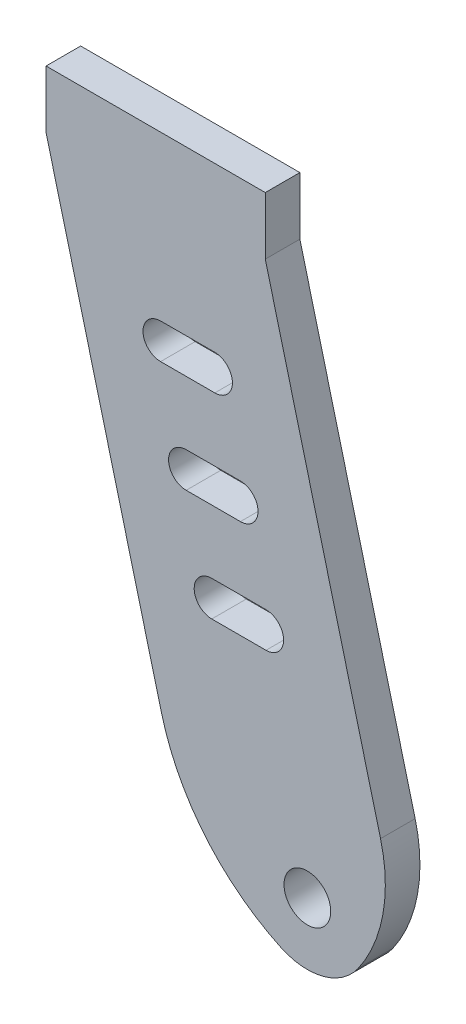
ISO-10303-21;
HEADER;
FILE_DESCRIPTION(('STEP AP214'),'2;1');
FILE_NAME('part.step','',(''),(''),'','','');
FILE_SCHEMA(('AUTOMOTIVE_DESIGN { 1 0 10303 214 1 1 1 1 }'));
ENDSEC;
DATA;
#1=APPLICATION_CONTEXT('core data for automotive mechanical design processes');
#2=APPLICATION_PROTOCOL_DEFINITION('international standard','automotive_design',2000,#1);
#3=PRODUCT_CONTEXT('',#1,'mechanical');
#4=PRODUCT('Part','Part','',(#3));
#5=PRODUCT_RELATED_PRODUCT_CATEGORY('part','',(#4));
#6=PRODUCT_DEFINITION_FORMATION('','',#4);
#7=PRODUCT_DEFINITION_CONTEXT('part definition',#1,'design');
#8=PRODUCT_DEFINITION('design','',#6,#7);
#9=PRODUCT_DEFINITION_SHAPE('','',#8);
#10=(LENGTH_UNIT() NAMED_UNIT(*) SI_UNIT(.MILLI.,.METRE.));
#11=(NAMED_UNIT(*) PLANE_ANGLE_UNIT() SI_UNIT($,.RADIAN.));
#12=(NAMED_UNIT(*) SI_UNIT($,.STERADIAN.) SOLID_ANGLE_UNIT());
#13=UNCERTAINTY_MEASURE_WITH_UNIT(LENGTH_MEASURE(1.E-05),#10,'distance_accuracy_value','');
#14=(GEOMETRIC_REPRESENTATION_CONTEXT(3) GLOBAL_UNCERTAINTY_ASSIGNED_CONTEXT((#13)) GLOBAL_UNIT_ASSIGNED_CONTEXT((#10,
#11,#12)) REPRESENTATION_CONTEXT('',''));
#15=CARTESIAN_POINT('',(0.,0.,0.));
#16=DIRECTION('',(0.,0.,1.));
#17=DIRECTION('',(1.,0.,0.));
#18=AXIS2_PLACEMENT_3D('',#15,#16,#17);
#19=CARTESIAN_POINT('',(56.937215015227,-77.4103110623859,6.));
#20=DIRECTION('',(0.,0.,1.));
#21=DIRECTION('',(1.,0.,0.));
#22=AXIS2_PLACEMENT_3D('',#19,#20,#21);
#23=PLANE('',#22);
#24=DIRECTION('',(0.,-1.,0.));
#25=VECTOR('',#24,1.);
#26=CARTESIAN_POINT('',(0.,0.,6.));
#27=LINE('',#26,#25);
#28=CARTESIAN_POINT('',(0.,0.,6.));
#29=VERTEX_POINT('',#28);
#30=CARTESIAN_POINT('',(0.,-10.,6.));
#31=VERTEX_POINT('',#30);
#32=EDGE_CURVE('E325',#29,#31,#27,.T.);
#33=ORIENTED_EDGE('',*,*,#32,.T.);
#34=DIRECTION('',(0.251163451319716,-0.967944688874921,0.));
#35=VECTOR('',#34,1.);
#36=CARTESIAN_POINT('',(0.,-10.,6.));
#37=LINE('',#36,#35);
#38=CARTESIAN_POINT('',(19.9800525524834,-87.,6.));
#39=VERTEX_POINT('',#38);
#40=EDGE_CURVE('E329',#31,#39,#37,.T.);
#41=ORIENTED_EDGE('',*,*,#40,.T.);
#42=CARTESIAN_POINT('',(56.937215015227,-77.4103110623859,6.));
#43=DIRECTION('',(0.,0.,1.));
#44=DIRECTION('',(1.,0.,0.));
#45=AXIS2_PLACEMENT_3D('',#42,#43,#44);
#46=CIRCLE('',#45,38.181068492354);
#47=CARTESIAN_POINT('',(40.7377652284611,-111.984460622771,6.));
#48=VERTEX_POINT('',#47);
#49=EDGE_CURVE('E333',#39,#48,#46,.T.);
#50=ORIENTED_EDGE('',*,*,#49,.T.);
#51=CARTESIAN_POINT('',(45.2987712999021,-102.25,6.));
#52=DIRECTION('',(0.,0.,1.));
#53=DIRECTION('',(1.,0.,0.));
#54=AXIS2_PLACEMENT_3D('',#51,#52,#53);
#55=CIRCLE('',#54,10.75);
#56=CARTESIAN_POINT('',(54.0934979884277,-108.431851055642,6.));
#57=VERTEX_POINT('',#56);
#58=EDGE_CURVE('E336',#48,#57,#55,.T.);
#59=ORIENTED_EDGE('',*,*,#58,.T.);
#60=CARTESIAN_POINT('',(32.8718944540329,-93.5150950428975,6.));
#61=DIRECTION('',(0.,0.,1.));
#62=DIRECTION('',(1.,0.,0.));
#63=AXIS2_PLACEMENT_3D('',#60,#61,#62);
#64=CIRCLE('',#63,25.9396620354772);
#65=CARTESIAN_POINT('',(57.9800525524834,-87.,6.));
#66=VERTEX_POINT('',#65);
#67=EDGE_CURVE('E339',#57,#66,#64,.T.);
#68=ORIENTED_EDGE('',*,*,#67,.T.);
#69=DIRECTION('',(-0.251163451319716,0.967944688874921,0.));
#70=VECTOR('',#69,1.);
#71=CARTESIAN_POINT('',(57.9800525524834,-87.,6.));
#72=LINE('',#71,#70);
#73=CARTESIAN_POINT('',(38.,-10.,6.));
#74=VERTEX_POINT('',#73);
#75=EDGE_CURVE('E342',#66,#74,#72,.T.);
#76=ORIENTED_EDGE('',*,*,#75,.T.);
#77=DIRECTION('',(0.,1.,0.));
#78=VECTOR('',#77,1.);
#79=CARTESIAN_POINT('',(38.,0.,6.));
#80=LINE('',#79,#78);
#81=CARTESIAN_POINT('',(38.,0.,6.));
#82=VERTEX_POINT('',#81);
#83=EDGE_CURVE('E345',#74,#82,#80,.T.);
#84=ORIENTED_EDGE('',*,*,#83,.T.);
#85=DIRECTION('',(-1.,0.,0.));
#86=VECTOR('',#85,1.);
#87=CARTESIAN_POINT('',(0.,0.,6.));
#88=LINE('',#87,#86);
#89=EDGE_CURVE('E348',#82,#29,#88,.T.);
#90=ORIENTED_EDGE('',*,*,#89,.T.);
#91=EDGE_LOOP('',(#33,#41,#50,#59,#68,#76,#84,#90));
#92=FACE_BOUND('',#91,.T.);
#93=CARTESIAN_POINT('',(45.2987712999021,-102.25,6.));
#94=DIRECTION('',(0.,0.,1.));
#95=DIRECTION('',(1.,0.,0.));
#96=AXIS2_PLACEMENT_3D('',#93,#94,#95);
#97=CIRCLE('',#96,4.05);
#98=CARTESIAN_POINT('',(49.3487712999021,-102.25,6.));
#99=VERTEX_POINT('',#98);
#100=EDGE_CURVE('E317',#99,#99,#97,.T.);
#101=ORIENTED_EDGE('',*,*,#100,.F.);
#102=EDGE_LOOP('',(#101));
#103=FACE_BOUND('',#102,.T.);
#104=DIRECTION('',(1.,0.,0.));
#105=VECTOR('',#104,1.);
#106=CARTESIAN_POINT('',(24.2900262762417,-51.55,6.));
#107=LINE('',#106,#105);
#108=CARTESIAN_POINT('',(24.2900262762417,-51.55,6.));
#109=VERTEX_POINT('',#108);
#110=CARTESIAN_POINT('',(33.6900262762417,-51.55,6.));
#111=VERTEX_POINT('',#110);
#112=EDGE_CURVE('E277',#109,#111,#107,.T.);
#113=ORIENTED_EDGE('',*,*,#112,.F.);
#114=CARTESIAN_POINT('',(24.2900262762417,-48.5,6.));
#115=DIRECTION('',(0.,0.,1.));
#116=DIRECTION('',(1.,0.,0.));
#117=AXIS2_PLACEMENT_3D('',#114,#115,#116);
#118=CIRCLE('',#117,3.05000000000001);
#119=CARTESIAN_POINT('',(24.2900262762417,-45.45,6.));
#120=VERTEX_POINT('',#119);
#121=EDGE_CURVE('E274',#120,#109,#118,.T.);
#122=ORIENTED_EDGE('',*,*,#121,.F.);
#123=DIRECTION('',(-1.,0.,0.));
#124=VECTOR('',#123,1.);
#125=CARTESIAN_POINT('',(24.2900262762417,-45.45,6.));
#126=LINE('',#125,#124);
#127=CARTESIAN_POINT('',(33.6900262762417,-45.45,6.));
#128=VERTEX_POINT('',#127);
#129=EDGE_CURVE('E285',#128,#120,#126,.T.);
#130=ORIENTED_EDGE('',*,*,#129,.F.);
#131=CARTESIAN_POINT('',(33.6900262762417,-48.5,6.));
#132=DIRECTION('',(0.,0.,1.));
#133=DIRECTION('',(1.,0.,0.));
#134=AXIS2_PLACEMENT_3D('',#131,#132,#133);
#135=CIRCLE('',#134,3.05000000000001);
#136=EDGE_CURVE('E281',#111,#128,#135,.T.);
#137=ORIENTED_EDGE('',*,*,#136,.F.);
#138=EDGE_LOOP('',(#113,#122,#130,#137));
#139=FACE_BOUND('',#138,.T.);
#140=DIRECTION('',(1.,0.,0.));
#141=VECTOR('',#140,1.);
#142=CARTESIAN_POINT('',(28.7271548301049,-68.65,6.));
#143=LINE('',#142,#141);
#144=CARTESIAN_POINT('',(28.7271548301049,-68.65,6.));
#145=VERTEX_POINT('',#144);
#146=CARTESIAN_POINT('',(38.1271548301049,-68.65,6.));
#147=VERTEX_POINT('',#146);
#148=EDGE_CURVE('E234',#145,#147,#143,.T.);
#149=ORIENTED_EDGE('',*,*,#148,.F.);
#150=CARTESIAN_POINT('',(28.7271548301049,-65.6,6.));
#151=DIRECTION('',(0.,0.,1.));
#152=DIRECTION('',(1.,0.,0.));
#153=AXIS2_PLACEMENT_3D('',#150,#151,#152);
#154=CIRCLE('',#153,3.05);
#155=CARTESIAN_POINT('',(28.7271548301049,-62.55,6.));
#156=VERTEX_POINT('',#155);
#157=EDGE_CURVE('E231',#156,#145,#154,.T.);
#158=ORIENTED_EDGE('',*,*,#157,.F.);
#159=DIRECTION('',(-1.,0.,0.));
#160=VECTOR('',#159,1.);
#161=CARTESIAN_POINT('',(28.7271548301049,-62.55,6.));
#162=LINE('',#161,#160);
#163=CARTESIAN_POINT('',(38.1271548301049,-62.55,6.));
#164=VERTEX_POINT('',#163);
#165=EDGE_CURVE('E242',#164,#156,#162,.T.);
#166=ORIENTED_EDGE('',*,*,#165,.F.);
#167=CARTESIAN_POINT('',(38.1271548301049,-65.6,6.));
#168=DIRECTION('',(0.,0.,1.));
#169=DIRECTION('',(1.,0.,0.));
#170=AXIS2_PLACEMENT_3D('',#167,#168,#169);
#171=CIRCLE('',#170,3.05);
#172=EDGE_CURVE('E238',#147,#164,#171,.T.);
#173=ORIENTED_EDGE('',*,*,#172,.F.);
#174=EDGE_LOOP('',(#149,#158,#166,#173));
#175=FACE_BOUND('',#174,.T.);
#176=DIRECTION('',(1.,0.,0.));
#177=VECTOR('',#176,1.);
#178=CARTESIAN_POINT('',(19.8528977223785,-34.45,6.));
#179=LINE('',#178,#177);
#180=CARTESIAN_POINT('',(19.8528977223785,-34.45,6.));
#181=VERTEX_POINT('',#180);
#182=CARTESIAN_POINT('',(29.2528977223785,-34.45,6.));
#183=VERTEX_POINT('',#182);
#184=EDGE_CURVE('E192',#181,#183,#179,.T.);
#185=ORIENTED_EDGE('',*,*,#184,.F.);
#186=CARTESIAN_POINT('',(19.8528977223785,-31.4,6.));
#187=DIRECTION('',(0.,0.,1.));
#188=DIRECTION('',(1.,0.,0.));
#189=AXIS2_PLACEMENT_3D('',#186,#187,#188);
#190=CIRCLE('',#189,3.05);
#191=CARTESIAN_POINT('',(19.8528977223785,-28.35,6.));
#192=VERTEX_POINT('',#191);
#193=EDGE_CURVE('E183',#192,#181,#190,.T.);
#194=ORIENTED_EDGE('',*,*,#193,.F.);
#195=DIRECTION('',(-1.,0.,0.));
#196=VECTOR('',#195,1.);
#197=CARTESIAN_POINT('',(19.8528977223785,-28.35,6.));
#198=LINE('',#197,#196);
#199=CARTESIAN_POINT('',(29.2528977223785,-28.35,6.));
#200=VERTEX_POINT('',#199);
#201=EDGE_CURVE('E209',#200,#192,#198,.T.);
#202=ORIENTED_EDGE('',*,*,#201,.F.);
#203=CARTESIAN_POINT('',(29.2528977223785,-31.4,6.));
#204=DIRECTION('',(0.,0.,1.));
#205=DIRECTION('',(1.,0.,0.));
#206=AXIS2_PLACEMENT_3D('',#203,#204,#205);
#207=CIRCLE('',#206,3.05);
#208=EDGE_CURVE('E205',#183,#200,#207,.T.);
#209=ORIENTED_EDGE('',*,*,#208,.F.);
#210=EDGE_LOOP('',(#185,#194,#202,#209));
#211=FACE_BOUND('',#210,.T.);
#212=ADVANCED_FACE('F45',(#92,#103,#139,#175,#211),#23,.T.);
#213=CARTESIAN_POINT('',(56.937215015227,-77.4103110623859,0.));
#214=DIRECTION('',(0.,0.,1.));
#215=DIRECTION('',(1.,0.,0.));
#216=AXIS2_PLACEMENT_3D('',#213,#214,#215);
#217=PLANE('',#216);
#218=CARTESIAN_POINT('',(28.7271548301049,-65.6,0.));
#219=DIRECTION('',(0.,0.,1.));
#220=DIRECTION('',(1.,0.,0.));
#221=AXIS2_PLACEMENT_3D('',#218,#219,#220);
#222=CIRCLE('',#221,3.05);
#223=CARTESIAN_POINT('',(28.7271548301049,-62.55,0.));
#224=VERTEX_POINT('',#223);
#225=CARTESIAN_POINT('',(28.7271548301049,-68.65,0.));
#226=VERTEX_POINT('',#225);
#227=EDGE_CURVE('E201',#224,#226,#222,.T.);
#228=ORIENTED_EDGE('',*,*,#227,.T.);
#229=DIRECTION('',(1.,0.,0.));
#230=VECTOR('',#229,1.);
#231=CARTESIAN_POINT('',(28.7271548301049,-68.65,0.));
#232=LINE('',#231,#230);
#233=CARTESIAN_POINT('',(38.1271548301049,-68.65,0.));
#234=VERTEX_POINT('',#233);
#235=EDGE_CURVE('E249',#226,#234,#232,.T.);
#236=ORIENTED_EDGE('',*,*,#235,.T.);
#237=CARTESIAN_POINT('',(38.1271548301049,-65.6,0.));
#238=DIRECTION('',(0.,0.,1.));
#239=DIRECTION('',(1.,0.,0.));
#240=AXIS2_PLACEMENT_3D('',#237,#238,#239);
#241=CIRCLE('',#240,3.05);
#242=CARTESIAN_POINT('',(38.1271548301049,-62.55,0.));
#243=VERTEX_POINT('',#242);
#244=EDGE_CURVE('E253',#234,#243,#241,.T.);
#245=ORIENTED_EDGE('',*,*,#244,.T.);
#246=DIRECTION('',(-1.,0.,0.));
#247=VECTOR('',#246,1.);
#248=CARTESIAN_POINT('',(28.7271548301049,-62.55,0.));
#249=LINE('',#248,#247);
#250=EDGE_CURVE('E235',#243,#224,#249,.T.);
#251=ORIENTED_EDGE('',*,*,#250,.T.);
#252=EDGE_LOOP('',(#228,#236,#245,#251));
#253=FACE_BOUND('',#252,.T.);
#254=CARTESIAN_POINT('',(45.2987712999021,-102.25,0.));
#255=DIRECTION('',(0.,0.,1.));
#256=DIRECTION('',(1.,0.,0.));
#257=AXIS2_PLACEMENT_3D('',#254,#255,#256);
#258=CIRCLE('',#257,4.05);
#259=CARTESIAN_POINT('',(49.3487712999021,-102.25,0.));
#260=VERTEX_POINT('',#259);
#261=EDGE_CURVE('E316',#260,#260,#258,.T.);
#262=ORIENTED_EDGE('',*,*,#261,.T.);
#263=EDGE_LOOP('',(#262));
#264=FACE_BOUND('',#263,.T.);
#265=DIRECTION('',(0.,-1.,0.));
#266=VECTOR('',#265,1.);
#267=CARTESIAN_POINT('',(0.,0.,0.));
#268=LINE('',#267,#266);
#269=CARTESIAN_POINT('',(0.,0.,0.));
#270=VERTEX_POINT('',#269);
#271=CARTESIAN_POINT('',(0.,-10.,0.));
#272=VERTEX_POINT('',#271);
#273=EDGE_CURVE('E321',#270,#272,#268,.T.);
#274=ORIENTED_EDGE('',*,*,#273,.F.);
#275=DIRECTION('',(-1.,0.,0.));
#276=VECTOR('',#275,1.);
#277=CARTESIAN_POINT('',(0.,0.,0.));
#278=LINE('',#277,#276);
#279=CARTESIAN_POINT('',(38.,0.,0.));
#280=VERTEX_POINT('',#279);
#281=EDGE_CURVE('E330',#280,#270,#278,.T.);
#282=ORIENTED_EDGE('',*,*,#281,.F.);
#283=DIRECTION('',(0.,1.,0.));
#284=VECTOR('',#283,1.);
#285=CARTESIAN_POINT('',(38.,0.,0.));
#286=LINE('',#285,#284);
#287=CARTESIAN_POINT('',(38.,-10.,0.));
#288=VERTEX_POINT('',#287);
#289=EDGE_CURVE('E370',#288,#280,#286,.T.);
#290=ORIENTED_EDGE('',*,*,#289,.F.);
#291=DIRECTION('',(-0.251163451319716,0.967944688874921,0.));
#292=VECTOR('',#291,1.);
#293=CARTESIAN_POINT('',(57.9800525524834,-87.,0.));
#294=LINE('',#293,#292);
#295=CARTESIAN_POINT('',(57.9800525524834,-87.,0.));
#296=VERTEX_POINT('',#295);
#297=EDGE_CURVE('E367',#296,#288,#294,.T.);
#298=ORIENTED_EDGE('',*,*,#297,.F.);
#299=CARTESIAN_POINT('',(32.8718944540329,-93.5150950428975,0.));
#300=DIRECTION('',(0.,0.,1.));
#301=DIRECTION('',(1.,0.,0.));
#302=AXIS2_PLACEMENT_3D('',#299,#300,#301);
#303=CIRCLE('',#302,25.9396620354772);
#304=CARTESIAN_POINT('',(54.0934979884277,-108.431851055642,0.));
#305=VERTEX_POINT('',#304);
#306=EDGE_CURVE('E364',#305,#296,#303,.T.);
#307=ORIENTED_EDGE('',*,*,#306,.F.);
#308=CARTESIAN_POINT('',(45.2987712999021,-102.25,0.));
#309=DIRECTION('',(0.,0.,1.));
#310=DIRECTION('',(1.,0.,0.));
#311=AXIS2_PLACEMENT_3D('',#308,#309,#310);
#312=CIRCLE('',#311,10.75);
#313=CARTESIAN_POINT('',(40.7377652284611,-111.984460622771,0.));
#314=VERTEX_POINT('',#313);
#315=EDGE_CURVE('E361',#314,#305,#312,.T.);
#316=ORIENTED_EDGE('',*,*,#315,.F.);
#317=CARTESIAN_POINT('',(56.937215015227,-77.4103110623859,0.));
#318=DIRECTION('',(0.,0.,1.));
#319=DIRECTION('',(1.,0.,0.));
#320=AXIS2_PLACEMENT_3D('',#317,#318,#319);
#321=CIRCLE('',#320,38.181068492354);
#322=CARTESIAN_POINT('',(19.9800525524834,-87.,0.));
#323=VERTEX_POINT('',#322);
#324=EDGE_CURVE('E358',#323,#314,#321,.T.);
#325=ORIENTED_EDGE('',*,*,#324,.F.);
#326=DIRECTION('',(0.251163451319716,-0.967944688874921,0.));
#327=VECTOR('',#326,1.);
#328=CARTESIAN_POINT('',(0.,-10.,0.));
#329=LINE('',#328,#327);
#330=EDGE_CURVE('E355',#272,#323,#329,.T.);
#331=ORIENTED_EDGE('',*,*,#330,.F.);
#332=EDGE_LOOP('',(#274,#282,#290,#298,#307,#316,#325,#331));
#333=FACE_BOUND('',#332,.T.);
#334=CARTESIAN_POINT('',(24.2900262762417,-48.5,0.));
#335=DIRECTION('',(0.,0.,1.));
#336=DIRECTION('',(1.,0.,0.));
#337=AXIS2_PLACEMENT_3D('',#334,#335,#336);
#338=CIRCLE('',#337,3.05000000000001);
#339=CARTESIAN_POINT('',(24.2900262762417,-45.45,0.));
#340=VERTEX_POINT('',#339);
#341=CARTESIAN_POINT('',(24.2900262762417,-51.55,0.));
#342=VERTEX_POINT('',#341);
#343=EDGE_CURVE('E273',#340,#342,#338,.T.);
#344=ORIENTED_EDGE('',*,*,#343,.T.);
#345=DIRECTION('',(1.,0.,0.));
#346=VECTOR('',#345,1.);
#347=CARTESIAN_POINT('',(24.2900262762417,-51.55,0.));
#348=LINE('',#347,#346);
#349=CARTESIAN_POINT('',(33.6900262762417,-51.55,0.));
#350=VERTEX_POINT('',#349);
#351=EDGE_CURVE('E292',#342,#350,#348,.T.);
#352=ORIENTED_EDGE('',*,*,#351,.T.);
#353=CARTESIAN_POINT('',(33.6900262762417,-48.5,0.));
#354=DIRECTION('',(0.,0.,1.));
#355=DIRECTION('',(1.,0.,0.));
#356=AXIS2_PLACEMENT_3D('',#353,#354,#355);
#357=CIRCLE('',#356,3.05000000000001);
#358=CARTESIAN_POINT('',(33.6900262762417,-45.45,0.));
#359=VERTEX_POINT('',#358);
#360=EDGE_CURVE('E296',#350,#359,#357,.T.);
#361=ORIENTED_EDGE('',*,*,#360,.T.);
#362=DIRECTION('',(-1.,0.,0.));
#363=VECTOR('',#362,1.);
#364=CARTESIAN_POINT('',(24.2900262762417,-45.45,0.));
#365=LINE('',#364,#363);
#366=EDGE_CURVE('E278',#359,#340,#365,.T.);
#367=ORIENTED_EDGE('',*,*,#366,.T.);
#368=EDGE_LOOP('',(#344,#352,#361,#367));
#369=FACE_BOUND('',#368,.T.);
#370=CARTESIAN_POINT('',(19.8528977223785,-31.4,0.));
#371=DIRECTION('',(0.,0.,1.));
#372=DIRECTION('',(1.,0.,0.));
#373=AXIS2_PLACEMENT_3D('',#370,#371,#372);
#374=CIRCLE('',#373,3.05);
#375=CARTESIAN_POINT('',(19.8528977223785,-28.35,0.));
#376=VERTEX_POINT('',#375);
#377=CARTESIAN_POINT('',(19.8528977223785,-34.45,0.));
#378=VERTEX_POINT('',#377);
#379=EDGE_CURVE('E69',#376,#378,#374,.T.);
#380=ORIENTED_EDGE('',*,*,#379,.T.);
#381=DIRECTION('',(1.,0.,0.));
#382=VECTOR('',#381,1.);
#383=CARTESIAN_POINT('',(19.8528977223785,-34.45,0.));
#384=LINE('',#383,#382);
#385=CARTESIAN_POINT('',(29.2528977223785,-34.45,0.));
#386=VERTEX_POINT('',#385);
#387=EDGE_CURVE('E199',#378,#386,#384,.T.);
#388=ORIENTED_EDGE('',*,*,#387,.T.);
#389=CARTESIAN_POINT('',(29.2528977223785,-31.4,0.));
#390=DIRECTION('',(0.,0.,1.));
#391=DIRECTION('',(1.,0.,0.));
#392=AXIS2_PLACEMENT_3D('',#389,#390,#391);
#393=CIRCLE('',#392,3.05);
#394=CARTESIAN_POINT('',(29.2528977223785,-28.35,0.));
#395=VERTEX_POINT('',#394);
#396=EDGE_CURVE('E218',#386,#395,#393,.T.);
#397=ORIENTED_EDGE('',*,*,#396,.T.);
#398=DIRECTION('',(-1.,0.,0.));
#399=VECTOR('',#398,1.);
#400=CARTESIAN_POINT('',(19.8528977223785,-28.35,0.));
#401=LINE('',#400,#399);
#402=EDGE_CURVE('E193',#395,#376,#401,.T.);
#403=ORIENTED_EDGE('',*,*,#402,.T.);
#404=EDGE_LOOP('',(#380,#388,#397,#403));
#405=FACE_BOUND('',#404,.T.);
#406=ADVANCED_FACE('F409',(#253,#264,#333,#369,#405),#217,.F.);
#407=CARTESIAN_POINT('',(0.,0.,6.));
#408=DIRECTION('',(1.,0.,0.));
#409=DIRECTION('',(0.,1.,0.));
#410=AXIS2_PLACEMENT_3D('',#407,#408,#409);
#411=PLANE('',#410);
#412=ORIENTED_EDGE('',*,*,#273,.T.);
#413=DIRECTION('',(0.,0.,-1.));
#414=VECTOR('',#413,1.);
#415=CARTESIAN_POINT('',(0.,-10.,6.));
#416=LINE('',#415,#414);
#417=EDGE_CURVE('E11',#31,#272,#416,.T.);
#418=ORIENTED_EDGE('',*,*,#417,.F.);
#419=ORIENTED_EDGE('',*,*,#32,.F.);
#420=DIRECTION('',(0.,0.,-1.));
#421=VECTOR('',#420,1.);
#422=CARTESIAN_POINT('',(0.,0.,6.));
#423=LINE('',#422,#421);
#424=EDGE_CURVE('E351',#29,#270,#423,.T.);
#425=ORIENTED_EDGE('',*,*,#424,.T.);
#426=EDGE_LOOP('',(#412,#418,#419,#425));
#427=FACE_BOUND('',#426,.T.);
#428=ADVANCED_FACE('F47',(#427),#411,.F.);
#429=CARTESIAN_POINT('',(0.,-10.,6.));
#430=DIRECTION('',(0.967944688874921,0.251163451319716,0.));
#431=DIRECTION('',(-0.251163451319716,0.967944688874921,0.));
#432=AXIS2_PLACEMENT_3D('',#429,#430,#431);
#433=PLANE('',#432);
#434=ORIENTED_EDGE('',*,*,#330,.T.);
#435=DIRECTION('',(0.,0.,-1.));
#436=VECTOR('',#435,1.);
#437=CARTESIAN_POINT('',(19.9800525524834,-87.,6.));
#438=LINE('',#437,#436);
#439=EDGE_CURVE('E54',#39,#323,#438,.T.);
#440=ORIENTED_EDGE('',*,*,#439,.F.);
#441=ORIENTED_EDGE('',*,*,#40,.F.);
#442=ORIENTED_EDGE('',*,*,#417,.T.);
#443=EDGE_LOOP('',(#434,#440,#441,#442));
#444=FACE_BOUND('',#443,.T.);
#445=ADVANCED_FACE('F427',(#444),#433,.F.);
#446=CARTESIAN_POINT('',(56.937215015227,-77.4103110623859,6.));
#447=DIRECTION('',(0.,0.,-1.));
#448=DIRECTION('',(-1.,0.,0.));
#449=AXIS2_PLACEMENT_3D('',#446,#447,#448);
#450=CYLINDRICAL_SURFACE('',#449,38.181068492354);
#451=ORIENTED_EDGE('',*,*,#324,.T.);
#452=DIRECTION('',(0.,0.,-1.));
#453=VECTOR('',#452,1.);
#454=CARTESIAN_POINT('',(40.7377652284611,-111.984460622771,6.));
#455=LINE('',#454,#453);
#456=EDGE_CURVE('E394',#48,#314,#455,.T.);
#457=ORIENTED_EDGE('',*,*,#456,.F.);
#458=ORIENTED_EDGE('',*,*,#49,.F.);
#459=ORIENTED_EDGE('',*,*,#439,.T.);
#460=EDGE_LOOP('',(#451,#457,#458,#459));
#461=FACE_BOUND('',#460,.T.);
#462=ADVANCED_FACE('F403',(#461),#450,.T.);
#463=CARTESIAN_POINT('',(45.2987712999021,-102.25,6.));
#464=DIRECTION('',(0.,0.,-1.));
#465=DIRECTION('',(-1.,0.,0.));
#466=AXIS2_PLACEMENT_3D('',#463,#464,#465);
#467=CYLINDRICAL_SURFACE('',#466,10.75);
#468=ORIENTED_EDGE('',*,*,#315,.T.);
#469=DIRECTION('',(0.,0.,-1.));
#470=VECTOR('',#469,1.);
#471=CARTESIAN_POINT('',(54.0934979884277,-108.431851055642,6.));
#472=LINE('',#471,#470);
#473=EDGE_CURVE('E390',#57,#305,#472,.T.);
#474=ORIENTED_EDGE('',*,*,#473,.F.);
#475=ORIENTED_EDGE('',*,*,#58,.F.);
#476=ORIENTED_EDGE('',*,*,#456,.T.);
#477=EDGE_LOOP('',(#468,#474,#475,#476));
#478=FACE_BOUND('',#477,.T.);
#479=ADVANCED_FACE('F415',(#478),#467,.T.);
#480=CARTESIAN_POINT('',(32.8718944540329,-93.5150950428975,6.));
#481=DIRECTION('',(0.,0.,-1.));
#482=DIRECTION('',(-1.,0.,0.));
#483=AXIS2_PLACEMENT_3D('',#480,#481,#482);
#484=CYLINDRICAL_SURFACE('',#483,25.9396620354772);
#485=ORIENTED_EDGE('',*,*,#306,.T.);
#486=DIRECTION('',(0.,0.,-1.));
#487=VECTOR('',#486,1.);
#488=CARTESIAN_POINT('',(57.9800525524834,-87.,6.));
#489=LINE('',#488,#487);
#490=EDGE_CURVE('E386',#66,#296,#489,.T.);
#491=ORIENTED_EDGE('',*,*,#490,.F.);
#492=ORIENTED_EDGE('',*,*,#67,.F.);
#493=ORIENTED_EDGE('',*,*,#473,.T.);
#494=EDGE_LOOP('',(#485,#491,#492,#493));
#495=FACE_BOUND('',#494,.T.);
#496=ADVANCED_FACE('F419',(#495),#484,.T.);
#497=CARTESIAN_POINT('',(57.9800525524834,-87.,6.));
#498=DIRECTION('',(-0.967944688874921,-0.251163451319716,0.));
#499=DIRECTION('',(0.251163451319716,-0.967944688874921,0.));
#500=AXIS2_PLACEMENT_3D('',#497,#498,#499);
#501=PLANE('',#500);
#502=ORIENTED_EDGE('',*,*,#297,.T.);
#503=DIRECTION('',(0.,0.,-1.));
#504=VECTOR('',#503,1.);
#505=CARTESIAN_POINT('',(38.,-10.,6.));
#506=LINE('',#505,#504);
#507=EDGE_CURVE('E382',#74,#288,#506,.T.);
#508=ORIENTED_EDGE('',*,*,#507,.F.);
#509=ORIENTED_EDGE('',*,*,#75,.F.);
#510=ORIENTED_EDGE('',*,*,#490,.T.);
#511=EDGE_LOOP('',(#502,#508,#509,#510));
#512=FACE_BOUND('',#511,.T.);
#513=ADVANCED_FACE('F440',(#512),#501,.F.);
#514=CARTESIAN_POINT('',(38.,0.,6.));
#515=DIRECTION('',(-1.,0.,0.));
#516=DIRECTION('',(0.,0.,1.));
#517=AXIS2_PLACEMENT_3D('',#514,#515,#516);
#518=PLANE('',#517);
#519=ORIENTED_EDGE('',*,*,#289,.T.);
#520=DIRECTION('',(0.,0.,-1.));
#521=VECTOR('',#520,1.);
#522=CARTESIAN_POINT('',(38.,0.,6.));
#523=LINE('',#522,#521);
#524=EDGE_CURVE('E378',#82,#280,#523,.T.);
#525=ORIENTED_EDGE('',*,*,#524,.F.);
#526=ORIENTED_EDGE('',*,*,#83,.F.);
#527=ORIENTED_EDGE('',*,*,#507,.T.);
#528=EDGE_LOOP('',(#519,#525,#526,#527));
#529=FACE_BOUND('',#528,.T.);
#530=ADVANCED_FACE('F438',(#529),#518,.F.);
#531=CARTESIAN_POINT('',(0.,0.,6.));
#532=DIRECTION('',(0.,-1.,0.));
#533=DIRECTION('',(0.,0.,-1.));
#534=AXIS2_PLACEMENT_3D('',#531,#532,#533);
#535=PLANE('',#534);
#536=ORIENTED_EDGE('',*,*,#281,.T.);
#537=ORIENTED_EDGE('',*,*,#424,.F.);
#538=ORIENTED_EDGE('',*,*,#89,.F.);
#539=ORIENTED_EDGE('',*,*,#524,.T.);
#540=EDGE_LOOP('',(#536,#537,#538,#539));
#541=FACE_BOUND('',#540,.T.);
#542=ADVANCED_FACE('F433',(#541),#535,.F.);
#543=CARTESIAN_POINT('',(45.2987712999021,-102.25,6.));
#544=DIRECTION('',(0.,0.,-1.));
#545=DIRECTION('',(-1.,0.,0.));
#546=AXIS2_PLACEMENT_3D('',#543,#544,#545);
#547=CYLINDRICAL_SURFACE('',#546,4.05);
#548=ORIENTED_EDGE('',*,*,#100,.T.);
#549=EDGE_LOOP('',(#548));
#550=FACE_BOUND('',#549,.T.);
#551=ORIENTED_EDGE('',*,*,#261,.F.);
#552=EDGE_LOOP('',(#551));
#553=FACE_BOUND('',#552,.T.);
#554=ADVANCED_FACE('F457',(#550,#553),#547,.F.);
#555=CARTESIAN_POINT('',(24.2900262762417,-48.5,6.));
#556=DIRECTION('',(0.,0.,-1.));
#557=DIRECTION('',(-1.,0.,0.));
#558=AXIS2_PLACEMENT_3D('',#555,#556,#557);
#559=CYLINDRICAL_SURFACE('',#558,3.05000000000001);
#560=ORIENTED_EDGE('',*,*,#343,.F.);
#561=DIRECTION('',(0.,0.,-1.));
#562=VECTOR('',#561,1.);
#563=CARTESIAN_POINT('',(24.2900262762417,-45.45,6.));
#564=LINE('',#563,#562);
#565=EDGE_CURVE('E288',#120,#340,#564,.T.);
#566=ORIENTED_EDGE('',*,*,#565,.F.);
#567=ORIENTED_EDGE('',*,*,#121,.T.);
#568=DIRECTION('',(0.,0.,-1.));
#569=VECTOR('',#568,1.);
#570=CARTESIAN_POINT('',(24.2900262762417,-51.55,6.));
#571=LINE('',#570,#569);
#572=EDGE_CURVE('E312',#109,#342,#571,.T.);
#573=ORIENTED_EDGE('',*,*,#572,.T.);
#574=EDGE_LOOP('',(#560,#566,#567,#573));
#575=FACE_BOUND('',#574,.T.);
#576=ADVANCED_FACE('F464',(#575),#559,.F.);
#577=CARTESIAN_POINT('',(24.2900262762417,-51.55,6.));
#578=DIRECTION('',(0.,1.,0.));
#579=DIRECTION('',(0.,0.,1.));
#580=AXIS2_PLACEMENT_3D('',#577,#578,#579);
#581=PLANE('',#580);
#582=ORIENTED_EDGE('',*,*,#351,.F.);
#583=ORIENTED_EDGE('',*,*,#572,.F.);
#584=ORIENTED_EDGE('',*,*,#112,.T.);
#585=DIRECTION('',(0.,0.,-1.));
#586=VECTOR('',#585,1.);
#587=CARTESIAN_POINT('',(33.6900262762417,-51.55,6.));
#588=LINE('',#587,#586);
#589=EDGE_CURVE('E309',#111,#350,#588,.T.);
#590=ORIENTED_EDGE('',*,*,#589,.T.);
#591=EDGE_LOOP('',(#582,#583,#584,#590));
#592=FACE_BOUND('',#591,.T.);
#593=ADVANCED_FACE('F469',(#592),#581,.T.);
#594=CARTESIAN_POINT('',(33.6900262762417,-48.5,6.));
#595=DIRECTION('',(0.,0.,-1.));
#596=DIRECTION('',(-1.,0.,0.));
#597=AXIS2_PLACEMENT_3D('',#594,#595,#596);
#598=CYLINDRICAL_SURFACE('',#597,3.05000000000001);
#599=ORIENTED_EDGE('',*,*,#360,.F.);
#600=ORIENTED_EDGE('',*,*,#589,.F.);
#601=ORIENTED_EDGE('',*,*,#136,.T.);
#602=DIRECTION('',(0.,0.,-1.));
#603=VECTOR('',#602,1.);
#604=CARTESIAN_POINT('',(33.6900262762417,-45.45,6.));
#605=LINE('',#604,#603);
#606=EDGE_CURVE('E306',#128,#359,#605,.T.);
#607=ORIENTED_EDGE('',*,*,#606,.T.);
#608=EDGE_LOOP('',(#599,#600,#601,#607));
#609=FACE_BOUND('',#608,.T.);
#610=ADVANCED_FACE('F514',(#609),#598,.F.);
#611=CARTESIAN_POINT('',(24.2900262762417,-45.45,6.));
#612=DIRECTION('',(0.,-1.,0.));
#613=DIRECTION('',(0.,0.,-1.));
#614=AXIS2_PLACEMENT_3D('',#611,#612,#613);
#615=PLANE('',#614);
#616=ORIENTED_EDGE('',*,*,#366,.F.);
#617=ORIENTED_EDGE('',*,*,#606,.F.);
#618=ORIENTED_EDGE('',*,*,#129,.T.);
#619=ORIENTED_EDGE('',*,*,#565,.T.);
#620=EDGE_LOOP('',(#616,#617,#618,#619));
#621=FACE_BOUND('',#620,.T.);
#622=ADVANCED_FACE('F511',(#621),#615,.T.);
#623=CARTESIAN_POINT('',(28.7271548301049,-65.6,6.));
#624=DIRECTION('',(0.,0.,-1.));
#625=DIRECTION('',(-1.,0.,0.));
#626=AXIS2_PLACEMENT_3D('',#623,#624,#625);
#627=CYLINDRICAL_SURFACE('',#626,3.05);
#628=ORIENTED_EDGE('',*,*,#227,.F.);
#629=DIRECTION('',(0.,0.,-1.));
#630=VECTOR('',#629,1.);
#631=CARTESIAN_POINT('',(28.7271548301049,-62.55,6.));
#632=LINE('',#631,#630);
#633=EDGE_CURVE('E245',#156,#224,#632,.T.);
#634=ORIENTED_EDGE('',*,*,#633,.F.);
#635=ORIENTED_EDGE('',*,*,#157,.T.);
#636=DIRECTION('',(0.,0.,-1.));
#637=VECTOR('',#636,1.);
#638=CARTESIAN_POINT('',(28.7271548301049,-68.65,6.));
#639=LINE('',#638,#637);
#640=EDGE_CURVE('E269',#145,#226,#639,.T.);
#641=ORIENTED_EDGE('',*,*,#640,.T.);
#642=EDGE_LOOP('',(#628,#634,#635,#641));
#643=FACE_BOUND('',#642,.T.);
#644=ADVANCED_FACE('F493',(#643),#627,.F.);
#645=CARTESIAN_POINT('',(28.7271548301049,-68.65,6.));
#646=DIRECTION('',(0.,1.,0.));
#647=DIRECTION('',(0.,0.,1.));
#648=AXIS2_PLACEMENT_3D('',#645,#646,#647);
#649=PLANE('',#648);
#650=ORIENTED_EDGE('',*,*,#235,.F.);
#651=ORIENTED_EDGE('',*,*,#640,.F.);
#652=ORIENTED_EDGE('',*,*,#148,.T.);
#653=DIRECTION('',(0.,0.,-1.));
#654=VECTOR('',#653,1.);
#655=CARTESIAN_POINT('',(38.1271548301049,-68.65,6.));
#656=LINE('',#655,#654);
#657=EDGE_CURVE('E266',#147,#234,#656,.T.);
#658=ORIENTED_EDGE('',*,*,#657,.T.);
#659=EDGE_LOOP('',(#650,#651,#652,#658));
#660=FACE_BOUND('',#659,.T.);
#661=ADVANCED_FACE('F487',(#660),#649,.T.);
#662=CARTESIAN_POINT('',(38.1271548301049,-65.6,6.));
#663=DIRECTION('',(0.,0.,-1.));
#664=DIRECTION('',(-1.,0.,0.));
#665=AXIS2_PLACEMENT_3D('',#662,#663,#664);
#666=CYLINDRICAL_SURFACE('',#665,3.05);
#667=ORIENTED_EDGE('',*,*,#244,.F.);
#668=ORIENTED_EDGE('',*,*,#657,.F.);
#669=ORIENTED_EDGE('',*,*,#172,.T.);
#670=DIRECTION('',(0.,0.,-1.));
#671=VECTOR('',#670,1.);
#672=CARTESIAN_POINT('',(38.1271548301049,-62.55,6.));
#673=LINE('',#672,#671);
#674=EDGE_CURVE('E263',#164,#243,#673,.T.);
#675=ORIENTED_EDGE('',*,*,#674,.T.);
#676=EDGE_LOOP('',(#667,#668,#669,#675));
#677=FACE_BOUND('',#676,.T.);
#678=ADVANCED_FACE('F490',(#677),#666,.F.);
#679=CARTESIAN_POINT('',(28.7271548301049,-62.55,6.));
#680=DIRECTION('',(0.,-1.,0.));
#681=DIRECTION('',(0.,0.,-1.));
#682=AXIS2_PLACEMENT_3D('',#679,#680,#681);
#683=PLANE('',#682);
#684=ORIENTED_EDGE('',*,*,#250,.F.);
#685=ORIENTED_EDGE('',*,*,#674,.F.);
#686=ORIENTED_EDGE('',*,*,#165,.T.);
#687=ORIENTED_EDGE('',*,*,#633,.T.);
#688=EDGE_LOOP('',(#684,#685,#686,#687));
#689=FACE_BOUND('',#688,.T.);
#690=ADVANCED_FACE('F496',(#689),#683,.T.);
#691=CARTESIAN_POINT('',(19.8528977223785,-31.4,6.));
#692=DIRECTION('',(0.,0.,-1.));
#693=DIRECTION('',(-1.,0.,0.));
#694=AXIS2_PLACEMENT_3D('',#691,#692,#693);
#695=CYLINDRICAL_SURFACE('',#694,3.05);
#696=ORIENTED_EDGE('',*,*,#379,.F.);
#697=DIRECTION('',(0.,0.,-1.));
#698=VECTOR('',#697,1.);
#699=CARTESIAN_POINT('',(19.8528977223785,-28.35,6.));
#700=LINE('',#699,#698);
#701=EDGE_CURVE('E187',#192,#376,#700,.T.);
#702=ORIENTED_EDGE('',*,*,#701,.F.);
#703=ORIENTED_EDGE('',*,*,#193,.T.);
#704=DIRECTION('',(0.,0.,-1.));
#705=VECTOR('',#704,1.);
#706=CARTESIAN_POINT('',(19.8528977223785,-34.45,6.));
#707=LINE('',#706,#705);
#708=EDGE_CURVE('E186',#181,#378,#707,.T.);
#709=ORIENTED_EDGE('',*,*,#708,.T.);
#710=EDGE_LOOP('',(#696,#702,#703,#709));
#711=FACE_BOUND('',#710,.T.);
#712=ADVANCED_FACE('F185',(#711),#695,.F.);
#713=CARTESIAN_POINT('',(19.8528977223785,-34.45,6.));
#714=DIRECTION('',(0.,1.,0.));
#715=DIRECTION('',(0.,0.,1.));
#716=AXIS2_PLACEMENT_3D('',#713,#714,#715);
#717=PLANE('',#716);
#718=ORIENTED_EDGE('',*,*,#387,.F.);
#719=ORIENTED_EDGE('',*,*,#708,.F.);
#720=ORIENTED_EDGE('',*,*,#184,.T.);
#721=DIRECTION('',(0.,0.,-1.));
#722=VECTOR('',#721,1.);
#723=CARTESIAN_POINT('',(29.2528977223785,-34.45,6.));
#724=LINE('',#723,#722);
#725=EDGE_CURVE('E202',#183,#386,#724,.T.);
#726=ORIENTED_EDGE('',*,*,#725,.T.);
#727=EDGE_LOOP('',(#718,#719,#720,#726));
#728=FACE_BOUND('',#727,.T.);
#729=ADVANCED_FACE('F196',(#728),#717,.T.);
#730=CARTESIAN_POINT('',(29.2528977223785,-31.4,6.));
#731=DIRECTION('',(0.,0.,-1.));
#732=DIRECTION('',(-1.,0.,0.));
#733=AXIS2_PLACEMENT_3D('',#730,#731,#732);
#734=CYLINDRICAL_SURFACE('',#733,3.05);
#735=ORIENTED_EDGE('',*,*,#396,.F.);
#736=ORIENTED_EDGE('',*,*,#725,.F.);
#737=ORIENTED_EDGE('',*,*,#208,.T.);
#738=DIRECTION('',(0.,0.,-1.));
#739=VECTOR('',#738,1.);
#740=CARTESIAN_POINT('',(29.2528977223785,-28.35,6.));
#741=LINE('',#740,#739);
#742=EDGE_CURVE('E61',#200,#395,#741,.T.);
#743=ORIENTED_EDGE('',*,*,#742,.T.);
#744=EDGE_LOOP('',(#735,#736,#737,#743));
#745=FACE_BOUND('',#744,.T.);
#746=ADVANCED_FACE('F533',(#745),#734,.F.);
#747=CARTESIAN_POINT('',(19.8528977223785,-28.35,6.));
#748=DIRECTION('',(0.,-1.,0.));
#749=DIRECTION('',(0.,0.,-1.));
#750=AXIS2_PLACEMENT_3D('',#747,#748,#749);
#751=PLANE('',#750);
#752=ORIENTED_EDGE('',*,*,#402,.F.);
#753=ORIENTED_EDGE('',*,*,#742,.F.);
#754=ORIENTED_EDGE('',*,*,#201,.T.);
#755=ORIENTED_EDGE('',*,*,#701,.T.);
#756=EDGE_LOOP('',(#752,#753,#754,#755));
#757=FACE_BOUND('',#756,.T.);
#758=ADVANCED_FACE('F531',(#757),#751,.T.);
#759=CLOSED_SHELL('',(#212,#406,#428,#445,#462,#479,#496,#513,#530,#542,#554,#576,#593,#610,
#622,#644,#661,#678,#690,#712,#729,#746,#758));
#760=MANIFOLD_SOLID_BREP('B2',#759);
#761=ADVANCED_BREP_SHAPE_REPRESENTATION('',(#18,#760),#14);
#762=SHAPE_DEFINITION_REPRESENTATION(#9,#761);
ENDSEC;
END-ISO-10303-21;
